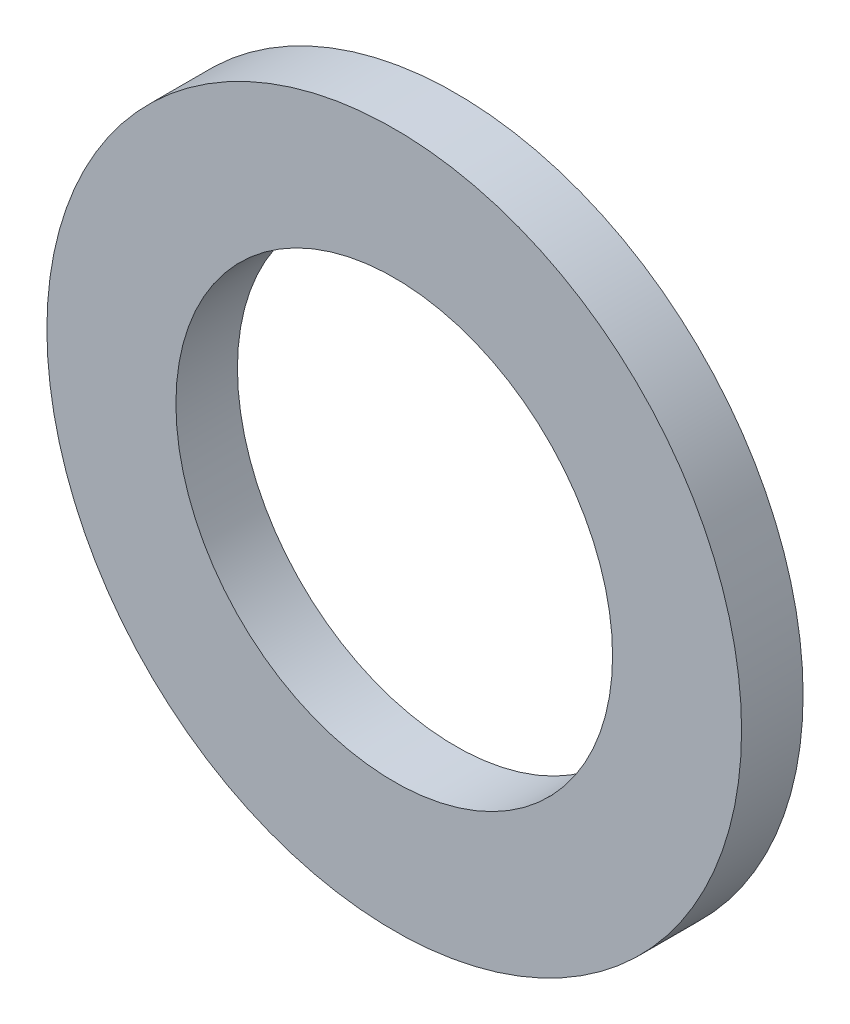
ISO-10303-21;
HEADER;
FILE_DESCRIPTION(('STEP AP214'),'2;1');
FILE_NAME('part.step','',(''),(''),'','','');
FILE_SCHEMA(('AUTOMOTIVE_DESIGN { 1 0 10303 214 1 1 1 1 }'));
ENDSEC;
DATA;
#1=APPLICATION_CONTEXT('core data for automotive mechanical design processes');
#2=APPLICATION_PROTOCOL_DEFINITION('international standard','automotive_design',2000,#1);
#3=PRODUCT_CONTEXT('',#1,'mechanical');
#4=PRODUCT('Part','Part','',(#3));
#5=PRODUCT_RELATED_PRODUCT_CATEGORY('part','',(#4));
#6=PRODUCT_DEFINITION_FORMATION('','',#4);
#7=PRODUCT_DEFINITION_CONTEXT('part definition',#1,'design');
#8=PRODUCT_DEFINITION('design','',#6,#7);
#9=PRODUCT_DEFINITION_SHAPE('','',#8);
#10=(LENGTH_UNIT() NAMED_UNIT(*) SI_UNIT(.MILLI.,.METRE.));
#11=(NAMED_UNIT(*) PLANE_ANGLE_UNIT() SI_UNIT($,.RADIAN.));
#12=(NAMED_UNIT(*) SI_UNIT($,.STERADIAN.) SOLID_ANGLE_UNIT());
#13=UNCERTAINTY_MEASURE_WITH_UNIT(LENGTH_MEASURE(1.E-05),#10,'distance_accuracy_value','');
#14=(GEOMETRIC_REPRESENTATION_CONTEXT(3) GLOBAL_UNCERTAINTY_ASSIGNED_CONTEXT((#13)) GLOBAL_UNIT_ASSIGNED_CONTEXT((#10,
#11,#12)) REPRESENTATION_CONTEXT('',''));
#15=CARTESIAN_POINT('',(0.,0.,0.));
#16=DIRECTION('',(0.,0.,1.));
#17=DIRECTION('',(1.,0.,0.));
#18=AXIS2_PLACEMENT_3D('',#15,#16,#17);
#19=CARTESIAN_POINT('',(0.,0.,31.));
#20=DIRECTION('',(0.,0.,1.));
#21=DIRECTION('',(1.,0.,0.));
#22=AXIS2_PLACEMENT_3D('',#19,#20,#21);
#23=PLANE('',#22);
#24=CARTESIAN_POINT('',(0.,0.,31.));
#25=DIRECTION('',(0.,0.,1.));
#26=DIRECTION('',(1.,0.,0.));
#27=AXIS2_PLACEMENT_3D('',#24,#25,#26);
#28=CIRCLE('',#27,175.);
#29=CARTESIAN_POINT('',(175.,0.,31.));
#30=VERTEX_POINT('',#29);
#31=EDGE_CURVE('E10',#30,#30,#28,.T.);
#32=ORIENTED_EDGE('',*,*,#31,.T.);
#33=EDGE_LOOP('',(#32));
#34=FACE_BOUND('',#33,.T.);
#35=CARTESIAN_POINT('',(0.,0.,31.));
#36=DIRECTION('',(0.,0.,1.));
#37=DIRECTION('',(1.,0.,0.));
#38=AXIS2_PLACEMENT_3D('',#35,#36,#37);
#39=CIRCLE('',#38,110.);
#40=CARTESIAN_POINT('',(110.,0.,31.));
#41=VERTEX_POINT('',#40);
#42=EDGE_CURVE('E50',#41,#41,#39,.T.);
#43=ORIENTED_EDGE('',*,*,#42,.F.);
#44=EDGE_LOOP('',(#43));
#45=FACE_BOUND('',#44,.T.);
#46=ADVANCED_FACE('F39',(#34,#45),#23,.T.);
#47=CARTESIAN_POINT('',(0.,0.,0.));
#48=DIRECTION('',(0.,0.,1.));
#49=DIRECTION('',(1.,0.,0.));
#50=AXIS2_PLACEMENT_3D('',#47,#48,#49);
#51=PLANE('',#50);
#52=CARTESIAN_POINT('',(0.,0.,0.));
#53=DIRECTION('',(0.,0.,1.));
#54=DIRECTION('',(1.,0.,0.));
#55=AXIS2_PLACEMENT_3D('',#52,#53,#54);
#56=CIRCLE('',#55,175.);
#57=CARTESIAN_POINT('',(175.,0.,0.));
#58=VERTEX_POINT('',#57);
#59=EDGE_CURVE('E43',#58,#58,#56,.T.);
#60=ORIENTED_EDGE('',*,*,#59,.F.);
#61=EDGE_LOOP('',(#60));
#62=FACE_BOUND('',#61,.T.);
#63=CARTESIAN_POINT('',(0.,0.,0.));
#64=DIRECTION('',(0.,0.,1.));
#65=DIRECTION('',(1.,0.,0.));
#66=AXIS2_PLACEMENT_3D('',#63,#64,#65);
#67=CIRCLE('',#66,110.);
#68=CARTESIAN_POINT('',(110.,0.,0.));
#69=VERTEX_POINT('',#68);
#70=EDGE_CURVE('E52',#69,#69,#67,.T.);
#71=ORIENTED_EDGE('',*,*,#70,.T.);
#72=EDGE_LOOP('',(#71));
#73=FACE_BOUND('',#72,.T.);
#74=ADVANCED_FACE('F62',(#62,#73),#51,.F.);
#75=CARTESIAN_POINT('',(0.,0.,31.));
#76=DIRECTION('',(0.,0.,-1.));
#77=DIRECTION('',(-1.,0.,0.));
#78=AXIS2_PLACEMENT_3D('',#75,#76,#77);
#79=CYLINDRICAL_SURFACE('',#78,175.);
#80=ORIENTED_EDGE('',*,*,#31,.F.);
#81=EDGE_LOOP('',(#80));
#82=FACE_BOUND('',#81,.T.);
#83=ORIENTED_EDGE('',*,*,#59,.T.);
#84=EDGE_LOOP('',(#83));
#85=FACE_BOUND('',#84,.T.);
#86=ADVANCED_FACE('F41',(#82,#85),#79,.T.);
#87=CARTESIAN_POINT('',(0.,0.,31.));
#88=DIRECTION('',(0.,0.,-1.));
#89=DIRECTION('',(-1.,0.,0.));
#90=AXIS2_PLACEMENT_3D('',#87,#88,#89);
#91=CYLINDRICAL_SURFACE('',#90,110.);
#92=ORIENTED_EDGE('',*,*,#42,.T.);
#93=EDGE_LOOP('',(#92));
#94=FACE_BOUND('',#93,.T.);
#95=ORIENTED_EDGE('',*,*,#70,.F.);
#96=EDGE_LOOP('',(#95));
#97=FACE_BOUND('',#96,.T.);
#98=ADVANCED_FACE('F58',(#94,#97),#91,.F.);
#99=CLOSED_SHELL('',(#46,#74,#86,#98));
#100=MANIFOLD_SOLID_BREP('B2',#99);
#101=ADVANCED_BREP_SHAPE_REPRESENTATION('',(#18,#100),#14);
#102=SHAPE_DEFINITION_REPRESENTATION(#9,#101);
ENDSEC;
END-ISO-10303-21;
